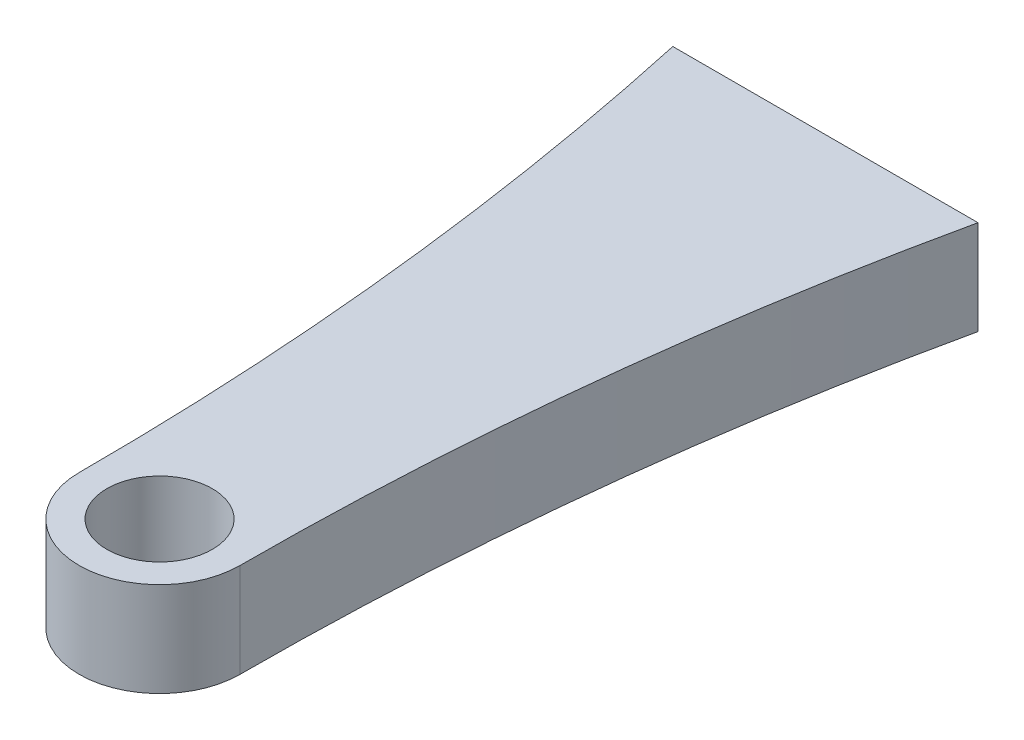
ISO-10303-21;
HEADER;
FILE_DESCRIPTION(('STEP AP214'),'2;1');
FILE_NAME('part.step','',(''),(''),'','','');
FILE_SCHEMA(('AUTOMOTIVE_DESIGN { 1 0 10303 214 1 1 1 1 }'));
ENDSEC;
DATA;
#1=APPLICATION_CONTEXT('core data for automotive mechanical design processes');
#2=APPLICATION_PROTOCOL_DEFINITION('international standard','automotive_design',2000,#1);
#3=PRODUCT_CONTEXT('',#1,'mechanical');
#4=PRODUCT('Part','Part','',(#3));
#5=PRODUCT_RELATED_PRODUCT_CATEGORY('part','',(#4));
#6=PRODUCT_DEFINITION_FORMATION('','',#4);
#7=PRODUCT_DEFINITION_CONTEXT('part definition',#1,'design');
#8=PRODUCT_DEFINITION('design','',#6,#7);
#9=PRODUCT_DEFINITION_SHAPE('','',#8);
#10=(LENGTH_UNIT() NAMED_UNIT(*) SI_UNIT(.MILLI.,.METRE.));
#11=(NAMED_UNIT(*) PLANE_ANGLE_UNIT() SI_UNIT($,.RADIAN.));
#12=(NAMED_UNIT(*) SI_UNIT($,.STERADIAN.) SOLID_ANGLE_UNIT());
#13=UNCERTAINTY_MEASURE_WITH_UNIT(LENGTH_MEASURE(1.E-05),#10,'distance_accuracy_value','');
#14=(GEOMETRIC_REPRESENTATION_CONTEXT(3) GLOBAL_UNCERTAINTY_ASSIGNED_CONTEXT((#13)) GLOBAL_UNIT_ASSIGNED_CONTEXT((#10,
#11,#12)) REPRESENTATION_CONTEXT('',''));
#15=CARTESIAN_POINT('',(0.,0.,0.));
#16=DIRECTION('',(0.,0.,1.));
#17=DIRECTION('',(1.,0.,0.));
#18=AXIS2_PLACEMENT_3D('',#15,#16,#17);
#19=CARTESIAN_POINT('',(730.054615384617,10.795,1.94289029309402E-13));
#20=DIRECTION('',(0.,1.,0.));
#21=DIRECTION('',(0.,0.,1.));
#22=AXIS2_PLACEMENT_3D('',#19,#20,#21);
#23=PLANE('',#22);
#24=CARTESIAN_POINT('',(730.054615384617,10.795,1.94289029309402E-13));
#25=DIRECTION('',(0.,-1.,0.));
#26=DIRECTION('',(0.,0.,1.));
#27=AXIS2_PLACEMENT_3D('',#24,#25,#26);
#28=CIRCLE('',#27,711.639615384617);
#29=CARTESIAN_POINT('',(18.415,10.795,0.));
#30=VERTEX_POINT('',#29);
#31=CARTESIAN_POINT('',(34.925,10.795,-152.4));
#32=VERTEX_POINT('',#31);
#33=EDGE_CURVE('E92',#30,#32,#28,.T.);
#34=ORIENTED_EDGE('',*,*,#33,.T.);
#35=DIRECTION('',(-1.,0.,0.));
#36=VECTOR('',#35,1.);
#37=CARTESIAN_POINT('',(-34.925,10.795,-152.4));
#38=LINE('',#37,#36);
#39=CARTESIAN_POINT('',(-34.925,10.795,-152.4));
#40=VERTEX_POINT('',#39);
#41=EDGE_CURVE('E87',#32,#40,#38,.T.);
#42=ORIENTED_EDGE('',*,*,#41,.T.);
#43=CARTESIAN_POINT('',(-730.054615384617,10.795,1.94289029309402E-13));
#44=DIRECTION('',(0.,-1.,0.));
#45=DIRECTION('',(0.,0.,-1.));
#46=AXIS2_PLACEMENT_3D('',#43,#44,#45);
#47=CIRCLE('',#46,711.639615384617);
#48=CARTESIAN_POINT('',(-18.415,10.795,0.));
#49=VERTEX_POINT('',#48);
#50=EDGE_CURVE('E90',#40,#49,#47,.T.);
#51=ORIENTED_EDGE('',*,*,#50,.T.);
#52=CARTESIAN_POINT('',(0.,10.795,0.));
#53=DIRECTION('',(0.,1.,0.));
#54=DIRECTION('',(0.,0.,1.));
#55=AXIS2_PLACEMENT_3D('',#52,#53,#54);
#56=CIRCLE('',#55,18.415);
#57=EDGE_CURVE('E57',#49,#30,#56,.T.);
#58=ORIENTED_EDGE('',*,*,#57,.T.);
#59=EDGE_LOOP('',(#34,#42,#51,#58));
#60=FACE_BOUND('',#59,.T.);
#61=CARTESIAN_POINT('',(0.,10.795,0.));
#62=DIRECTION('',(0.,1.,0.));
#63=DIRECTION('',(0.,0.,1.));
#64=AXIS2_PLACEMENT_3D('',#61,#62,#63);
#65=CIRCLE('',#64,12.065);
#66=CARTESIAN_POINT('',(0.,10.795,12.065));
#67=VERTEX_POINT('',#66);
#68=EDGE_CURVE('E112',#67,#67,#65,.T.);
#69=ORIENTED_EDGE('',*,*,#68,.F.);
#70=EDGE_LOOP('',(#69));
#71=FACE_BOUND('',#70,.T.);
#72=ADVANCED_FACE('F39',(#60,#71),#23,.T.);
#73=CARTESIAN_POINT('',(730.054615384617,-10.795,1.94289029309402E-13));
#74=DIRECTION('',(0.,1.,0.));
#75=DIRECTION('',(0.,0.,1.));
#76=AXIS2_PLACEMENT_3D('',#73,#74,#75);
#77=PLANE('',#76);
#78=CARTESIAN_POINT('',(730.054615384617,-10.795,1.94289029309402E-13));
#79=DIRECTION('',(0.,-1.,0.));
#80=DIRECTION('',(0.,0.,1.));
#81=AXIS2_PLACEMENT_3D('',#78,#79,#80);
#82=CIRCLE('',#81,711.639615384617);
#83=CARTESIAN_POINT('',(18.415,-10.795,0.));
#84=VERTEX_POINT('',#83);
#85=CARTESIAN_POINT('',(34.925,-10.795,-152.4));
#86=VERTEX_POINT('',#85);
#87=EDGE_CURVE('E108',#84,#86,#82,.T.);
#88=ORIENTED_EDGE('',*,*,#87,.F.);
#89=CARTESIAN_POINT('',(0.,-10.795,0.));
#90=DIRECTION('',(0.,1.,0.));
#91=DIRECTION('',(0.,0.,1.));
#92=AXIS2_PLACEMENT_3D('',#89,#90,#91);
#93=CIRCLE('',#92,18.415);
#94=CARTESIAN_POINT('',(-18.415,-10.795,0.));
#95=VERTEX_POINT('',#94);
#96=EDGE_CURVE('E80',#95,#84,#93,.T.);
#97=ORIENTED_EDGE('',*,*,#96,.F.);
#98=CARTESIAN_POINT('',(-730.054615384617,-10.795,1.94289029309402E-13));
#99=DIRECTION('',(0.,-1.,0.));
#100=DIRECTION('',(0.,0.,-1.));
#101=AXIS2_PLACEMENT_3D('',#98,#99,#100);
#102=CIRCLE('',#101,711.639615384617);
#103=CARTESIAN_POINT('',(-34.925,-10.795,-152.4));
#104=VERTEX_POINT('',#103);
#105=EDGE_CURVE('E74',#104,#95,#102,.T.);
#106=ORIENTED_EDGE('',*,*,#105,.F.);
#107=DIRECTION('',(-1.,0.,0.));
#108=VECTOR('',#107,1.);
#109=CARTESIAN_POINT('',(-34.925,-10.795,-152.4));
#110=LINE('',#109,#108);
#111=EDGE_CURVE('E97',#86,#104,#110,.T.);
#112=ORIENTED_EDGE('',*,*,#111,.F.);
#113=EDGE_LOOP('',(#88,#97,#106,#112));
#114=FACE_BOUND('',#113,.T.);
#115=CARTESIAN_POINT('',(0.,-10.795,0.));
#116=DIRECTION('',(0.,1.,0.));
#117=DIRECTION('',(0.,0.,1.));
#118=AXIS2_PLACEMENT_3D('',#115,#116,#117);
#119=CIRCLE('',#118,12.065);
#120=CARTESIAN_POINT('',(0.,-10.795,12.065));
#121=VERTEX_POINT('',#120);
#122=EDGE_CURVE('E130',#121,#121,#119,.T.);
#123=ORIENTED_EDGE('',*,*,#122,.T.);
#124=EDGE_LOOP('',(#123));
#125=FACE_BOUND('',#124,.T.);
#126=ADVANCED_FACE('F125',(#114,#125),#77,.F.);
#127=CARTESIAN_POINT('',(730.054615384617,10.795,1.94289029309402E-13));
#128=DIRECTION('',(0.,-1.,0.));
#129=DIRECTION('',(0.,0.,-1.));
#130=AXIS2_PLACEMENT_3D('',#127,#128,#129);
#131=CYLINDRICAL_SURFACE('',#130,711.639615384617);
#132=ORIENTED_EDGE('',*,*,#87,.T.);
#133=DIRECTION('',(0.,-1.,0.));
#134=VECTOR('',#133,1.);
#135=CARTESIAN_POINT('',(34.925,10.795,-152.4));
#136=LINE('',#135,#134);
#137=EDGE_CURVE('E11',#32,#86,#136,.T.);
#138=ORIENTED_EDGE('',*,*,#137,.F.);
#139=ORIENTED_EDGE('',*,*,#33,.F.);
#140=DIRECTION('',(0.,-1.,0.));
#141=VECTOR('',#140,1.);
#142=CARTESIAN_POINT('',(18.415,10.795,0.));
#143=LINE('',#142,#141);
#144=EDGE_CURVE('E104',#30,#84,#143,.T.);
#145=ORIENTED_EDGE('',*,*,#144,.T.);
#146=EDGE_LOOP('',(#132,#138,#139,#145));
#147=FACE_BOUND('',#146,.T.);
#148=ADVANCED_FACE('F41',(#147),#131,.F.);
#149=CARTESIAN_POINT('',(-34.925,10.795,-152.4));
#150=DIRECTION('',(0.,0.,1.));
#151=DIRECTION('',(1.,0.,0.));
#152=AXIS2_PLACEMENT_3D('',#149,#150,#151);
#153=PLANE('',#152);
#154=ORIENTED_EDGE('',*,*,#111,.T.);
#155=DIRECTION('',(0.,-1.,0.));
#156=VECTOR('',#155,1.);
#157=CARTESIAN_POINT('',(-34.925,10.795,-152.4));
#158=LINE('',#157,#156);
#159=EDGE_CURVE('E49',#40,#104,#158,.T.);
#160=ORIENTED_EDGE('',*,*,#159,.F.);
#161=ORIENTED_EDGE('',*,*,#41,.F.);
#162=ORIENTED_EDGE('',*,*,#137,.T.);
#163=EDGE_LOOP('',(#154,#160,#161,#162));
#164=FACE_BOUND('',#163,.T.);
#165=ADVANCED_FACE('F96',(#164),#153,.F.);
#166=CARTESIAN_POINT('',(-730.054615384617,10.795,1.94289029309402E-13));
#167=DIRECTION('',(0.,-1.,0.));
#168=DIRECTION('',(0.,0.,-1.));
#169=AXIS2_PLACEMENT_3D('',#166,#167,#168);
#170=CYLINDRICAL_SURFACE('',#169,711.639615384617);
#171=ORIENTED_EDGE('',*,*,#105,.T.);
#172=DIRECTION('',(0.,-1.,0.));
#173=VECTOR('',#172,1.);
#174=CARTESIAN_POINT('',(-18.415,10.795,0.));
#175=LINE('',#174,#173);
#176=EDGE_CURVE('E99',#49,#95,#175,.T.);
#177=ORIENTED_EDGE('',*,*,#176,.F.);
#178=ORIENTED_EDGE('',*,*,#50,.F.);
#179=ORIENTED_EDGE('',*,*,#159,.T.);
#180=EDGE_LOOP('',(#171,#177,#178,#179));
#181=FACE_BOUND('',#180,.T.);
#182=ADVANCED_FACE('F100',(#181),#170,.F.);
#183=CARTESIAN_POINT('',(0.,10.795,0.));
#184=DIRECTION('',(0.,-1.,0.));
#185=DIRECTION('',(0.,0.,-1.));
#186=AXIS2_PLACEMENT_3D('',#183,#184,#185);
#187=CYLINDRICAL_SURFACE('',#186,18.415);
#188=ORIENTED_EDGE('',*,*,#96,.T.);
#189=ORIENTED_EDGE('',*,*,#144,.F.);
#190=ORIENTED_EDGE('',*,*,#57,.F.);
#191=ORIENTED_EDGE('',*,*,#176,.T.);
#192=EDGE_LOOP('',(#188,#189,#190,#191));
#193=FACE_BOUND('',#192,.T.);
#194=ADVANCED_FACE('F122',(#193),#187,.T.);
#195=CARTESIAN_POINT('',(0.,10.795,0.));
#196=DIRECTION('',(0.,-1.,0.));
#197=DIRECTION('',(0.,0.,-1.));
#198=AXIS2_PLACEMENT_3D('',#195,#196,#197);
#199=CYLINDRICAL_SURFACE('',#198,12.065);
#200=ORIENTED_EDGE('',*,*,#68,.T.);
#201=EDGE_LOOP('',(#200));
#202=FACE_BOUND('',#201,.T.);
#203=ORIENTED_EDGE('',*,*,#122,.F.);
#204=EDGE_LOOP('',(#203));
#205=FACE_BOUND('',#204,.T.);
#206=ADVANCED_FACE('F138',(#202,#205),#199,.F.);
#207=CLOSED_SHELL('',(#72,#126,#148,#165,#182,#194,#206));
#208=MANIFOLD_SOLID_BREP('B2',#207);
#209=ADVANCED_BREP_SHAPE_REPRESENTATION('',(#18,#208),#14);
#210=SHAPE_DEFINITION_REPRESENTATION(#9,#209);
ENDSEC;
END-ISO-10303-21;
